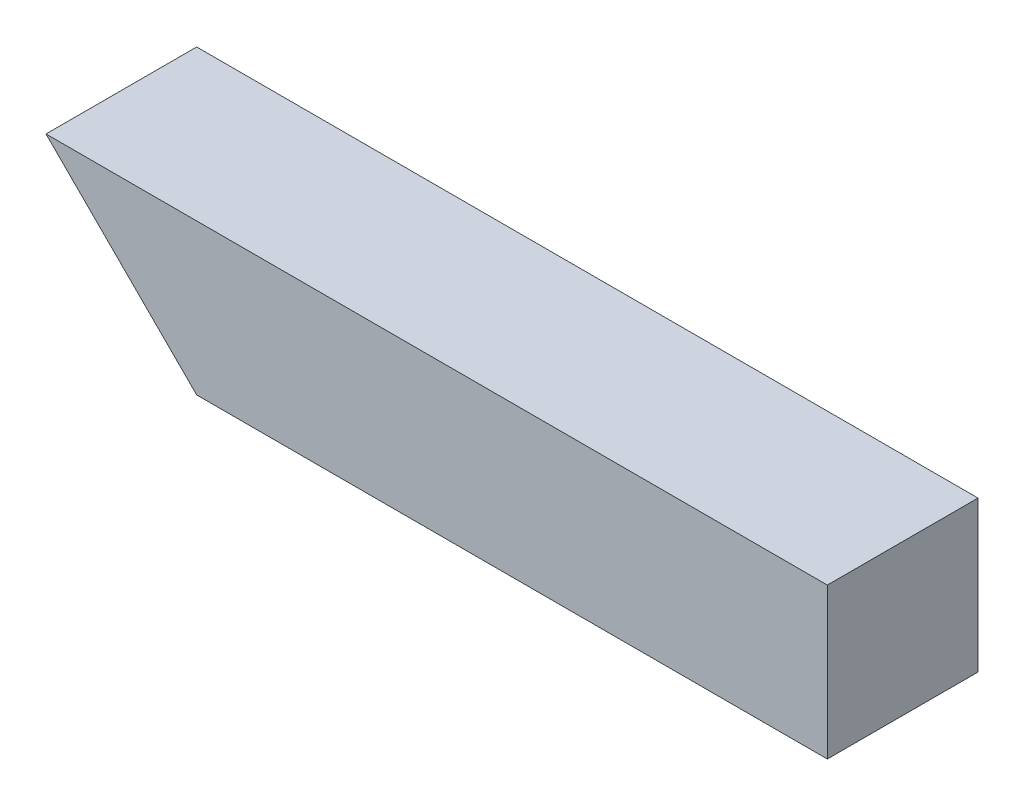
ISO-10303-21;
HEADER;
FILE_DESCRIPTION(('STEP AP214'),'2;1');
FILE_NAME('part.step','',(''),(''),'','','');
FILE_SCHEMA(('AUTOMOTIVE_DESIGN { 1 0 10303 214 1 1 1 1 }'));
ENDSEC;
DATA;
#1=APPLICATION_CONTEXT('core data for automotive mechanical design processes');
#2=APPLICATION_PROTOCOL_DEFINITION('international standard','automotive_design',2000,#1);
#3=PRODUCT_CONTEXT('',#1,'mechanical');
#4=PRODUCT('Part','Part','',(#3));
#5=PRODUCT_RELATED_PRODUCT_CATEGORY('part','',(#4));
#6=PRODUCT_DEFINITION_FORMATION('','',#4);
#7=PRODUCT_DEFINITION_CONTEXT('part definition',#1,'design');
#8=PRODUCT_DEFINITION('design','',#6,#7);
#9=PRODUCT_DEFINITION_SHAPE('','',#8);
#10=(LENGTH_UNIT() NAMED_UNIT(*) SI_UNIT(.MILLI.,.METRE.));
#11=(NAMED_UNIT(*) PLANE_ANGLE_UNIT() SI_UNIT($,.RADIAN.));
#12=(NAMED_UNIT(*) SI_UNIT($,.STERADIAN.) SOLID_ANGLE_UNIT());
#13=UNCERTAINTY_MEASURE_WITH_UNIT(LENGTH_MEASURE(1.E-05),#10,'distance_accuracy_value','');
#14=(GEOMETRIC_REPRESENTATION_CONTEXT(3) GLOBAL_UNCERTAINTY_ASSIGNED_CONTEXT((#13)) GLOBAL_UNIT_ASSIGNED_CONTEXT((#10,
#11,#12)) REPRESENTATION_CONTEXT('',''));
#15=CARTESIAN_POINT('',(0.,0.,0.));
#16=DIRECTION('',(0.,0.,1.));
#17=DIRECTION('',(1.,0.,0.));
#18=AXIS2_PLACEMENT_3D('',#15,#16,#17);
#19=CARTESIAN_POINT('',(197.565634586,0.,0.));
#20=DIRECTION('',(0.,0.,-1.));
#21=DIRECTION('',(0.,1.,0.));
#22=AXIS2_PLACEMENT_3D('',#19,#20,#21);
#23=PLANE('',#22);
#24=DIRECTION('',(-0.707106781186548,0.707106781186548,0.));
#25=VECTOR('',#24,1.);
#26=CARTESIAN_POINT('',(98.782817293,-98.782817293,0.));
#27=LINE('',#26,#25);
#28=CARTESIAN_POINT('',(38.1,-38.1,0.));
#29=VERTEX_POINT('',#28);
#30=CARTESIAN_POINT('',(0.,0.,0.));
#31=VERTEX_POINT('',#30);
#32=EDGE_CURVE('E58',#29,#31,#27,.T.);
#33=ORIENTED_EDGE('',*,*,#32,.F.);
#34=DIRECTION('',(-1.,0.,0.));
#35=VECTOR('',#34,1.);
#36=CARTESIAN_POINT('',(197.565634586,-38.1,0.));
#37=LINE('',#36,#35);
#38=CARTESIAN_POINT('',(197.565634586,-38.1,0.));
#39=VERTEX_POINT('',#38);
#40=EDGE_CURVE('E51',#39,#29,#37,.T.);
#41=ORIENTED_EDGE('',*,*,#40,.F.);
#42=DIRECTION('',(0.,-1.,0.));
#43=VECTOR('',#42,1.);
#44=CARTESIAN_POINT('',(197.565634586,0.,0.));
#45=LINE('',#44,#43);
#46=CARTESIAN_POINT('',(197.565634586,0.,0.));
#47=VERTEX_POINT('',#46);
#48=EDGE_CURVE('E109',#47,#39,#45,.T.);
#49=ORIENTED_EDGE('',*,*,#48,.F.);
#50=DIRECTION('',(-1.,0.,0.));
#51=VECTOR('',#50,1.);
#52=CARTESIAN_POINT('',(197.565634586,0.,0.));
#53=LINE('',#52,#51);
#54=EDGE_CURVE('E118',#47,#31,#53,.T.);
#55=ORIENTED_EDGE('',*,*,#54,.T.);
#56=EDGE_LOOP('',(#33,#41,#49,#55));
#57=FACE_BOUND('',#56,.T.);
#58=ADVANCED_FACE('F43',(#57),#23,.F.);
#59=CARTESIAN_POINT('',(197.565634586,0.,-38.1));
#60=DIRECTION('',(0.,0.,1.));
#61=DIRECTION('',(0.,-1.,0.));
#62=AXIS2_PLACEMENT_3D('',#59,#60,#61);
#63=PLANE('',#62);
#64=DIRECTION('',(0.707106781186548,-0.707106781186548,0.));
#65=VECTOR('',#64,1.);
#66=CARTESIAN_POINT('',(98.782817293,-98.782817293,-38.1));
#67=LINE('',#66,#65);
#68=CARTESIAN_POINT('',(0.,0.,-38.1));
#69=VERTEX_POINT('',#68);
#70=CARTESIAN_POINT('',(38.1,-38.1,-38.1));
#71=VERTEX_POINT('',#70);
#72=EDGE_CURVE('E11',#69,#71,#67,.T.);
#73=ORIENTED_EDGE('',*,*,#72,.F.);
#74=DIRECTION('',(-1.,0.,0.));
#75=VECTOR('',#74,1.);
#76=CARTESIAN_POINT('',(197.565634586,0.,-38.1));
#77=LINE('',#76,#75);
#78=CARTESIAN_POINT('',(197.565634586,0.,-38.1));
#79=VERTEX_POINT('',#78);
#80=EDGE_CURVE('E99',#79,#69,#77,.T.);
#81=ORIENTED_EDGE('',*,*,#80,.F.);
#82=DIRECTION('',(0.,1.,0.));
#83=VECTOR('',#82,1.);
#84=CARTESIAN_POINT('',(197.565634586,0.,-38.1));
#85=LINE('',#84,#83);
#86=CARTESIAN_POINT('',(197.565634586,-38.1,-38.1));
#87=VERTEX_POINT('',#86);
#88=EDGE_CURVE('E97',#87,#79,#85,.T.);
#89=ORIENTED_EDGE('',*,*,#88,.F.);
#90=DIRECTION('',(-1.,0.,0.));
#91=VECTOR('',#90,1.);
#92=CARTESIAN_POINT('',(197.565634586,-38.1,-38.1));
#93=LINE('',#92,#91);
#94=EDGE_CURVE('E93',#87,#71,#93,.T.);
#95=ORIENTED_EDGE('',*,*,#94,.T.);
#96=EDGE_LOOP('',(#73,#81,#89,#95));
#97=FACE_BOUND('',#96,.T.);
#98=ADVANCED_FACE('F95',(#97),#63,.F.);
#99=CARTESIAN_POINT('',(197.565634586,-38.1,0.));
#100=DIRECTION('',(0.,1.,0.));
#101=DIRECTION('',(0.,0.,1.));
#102=AXIS2_PLACEMENT_3D('',#99,#100,#101);
#103=PLANE('',#102);
#104=ORIENTED_EDGE('',*,*,#40,.T.);
#105=DIRECTION('',(0.,0.,-1.));
#106=VECTOR('',#105,1.);
#107=CARTESIAN_POINT('',(38.1,-38.1,255.976683414992));
#108=LINE('',#107,#106);
#109=EDGE_CURVE('E102',#29,#71,#108,.T.);
#110=ORIENTED_EDGE('',*,*,#109,.T.);
#111=ORIENTED_EDGE('',*,*,#94,.F.);
#112=DIRECTION('',(0.,0.,-1.));
#113=VECTOR('',#112,1.);
#114=CARTESIAN_POINT('',(197.565634586,-38.1,0.));
#115=LINE('',#114,#113);
#116=EDGE_CURVE('E88',#39,#87,#115,.T.);
#117=ORIENTED_EDGE('',*,*,#116,.F.);
#118=EDGE_LOOP('',(#104,#110,#111,#117));
#119=FACE_BOUND('',#118,.T.);
#120=ADVANCED_FACE('F103',(#119),#103,.F.);
#121=CARTESIAN_POINT('',(197.565634586,0.,0.));
#122=DIRECTION('',(0.,-1.,0.));
#123=DIRECTION('',(0.,0.,-1.));
#124=AXIS2_PLACEMENT_3D('',#121,#122,#123);
#125=PLANE('',#124);
#126=DIRECTION('',(0.,0.,1.));
#127=VECTOR('',#126,1.);
#128=CARTESIAN_POINT('',(0.,0.,0.));
#129=LINE('',#128,#127);
#130=EDGE_CURVE('E82',#69,#31,#129,.T.);
#131=ORIENTED_EDGE('',*,*,#130,.T.);
#132=ORIENTED_EDGE('',*,*,#54,.F.);
#133=DIRECTION('',(0.,0.,1.));
#134=VECTOR('',#133,1.);
#135=CARTESIAN_POINT('',(197.565634586,0.,0.));
#136=LINE('',#135,#134);
#137=EDGE_CURVE('E67',#79,#47,#136,.T.);
#138=ORIENTED_EDGE('',*,*,#137,.F.);
#139=ORIENTED_EDGE('',*,*,#80,.T.);
#140=EDGE_LOOP('',(#131,#132,#138,#139));
#141=FACE_BOUND('',#140,.T.);
#142=ADVANCED_FACE('F137',(#141),#125,.F.);
#143=CARTESIAN_POINT('',(197.565634586,0.,0.));
#144=DIRECTION('',(1.,0.,0.));
#145=DIRECTION('',(0.,0.,-1.));
#146=AXIS2_PLACEMENT_3D('',#143,#144,#145);
#147=PLANE('',#146);
#148=ORIENTED_EDGE('',*,*,#48,.T.);
#149=ORIENTED_EDGE('',*,*,#116,.T.);
#150=ORIENTED_EDGE('',*,*,#88,.T.);
#151=ORIENTED_EDGE('',*,*,#137,.T.);
#152=EDGE_LOOP('',(#148,#149,#150,#151));
#153=FACE_BOUND('',#152,.T.);
#154=ADVANCED_FACE('F127',(#153),#147,.T.);
#155=CARTESIAN_POINT('',(38.1,-38.1,255.976683414992));
#156=DIRECTION('',(-0.707106781186548,-0.707106781186548,0.));
#157=DIRECTION('',(0.707106781186548,-0.707106781186548,0.));
#158=AXIS2_PLACEMENT_3D('',#155,#156,#157);
#159=PLANE('',#158);
#160=ORIENTED_EDGE('',*,*,#109,.F.);
#161=ORIENTED_EDGE('',*,*,#32,.T.);
#162=ORIENTED_EDGE('',*,*,#130,.F.);
#163=ORIENTED_EDGE('',*,*,#72,.T.);
#164=EDGE_LOOP('',(#160,#161,#162,#163));
#165=FACE_BOUND('',#164,.T.);
#166=ADVANCED_FACE('F107',(#165),#159,.T.);
#167=CLOSED_SHELL('',(#58,#98,#120,#142,#154,#166));
#168=MANIFOLD_SOLID_BREP('B2',#167);
#169=ADVANCED_BREP_SHAPE_REPRESENTATION('',(#18,#168),#14);
#170=SHAPE_DEFINITION_REPRESENTATION(#9,#169);
ENDSEC;
END-ISO-10303-21;
